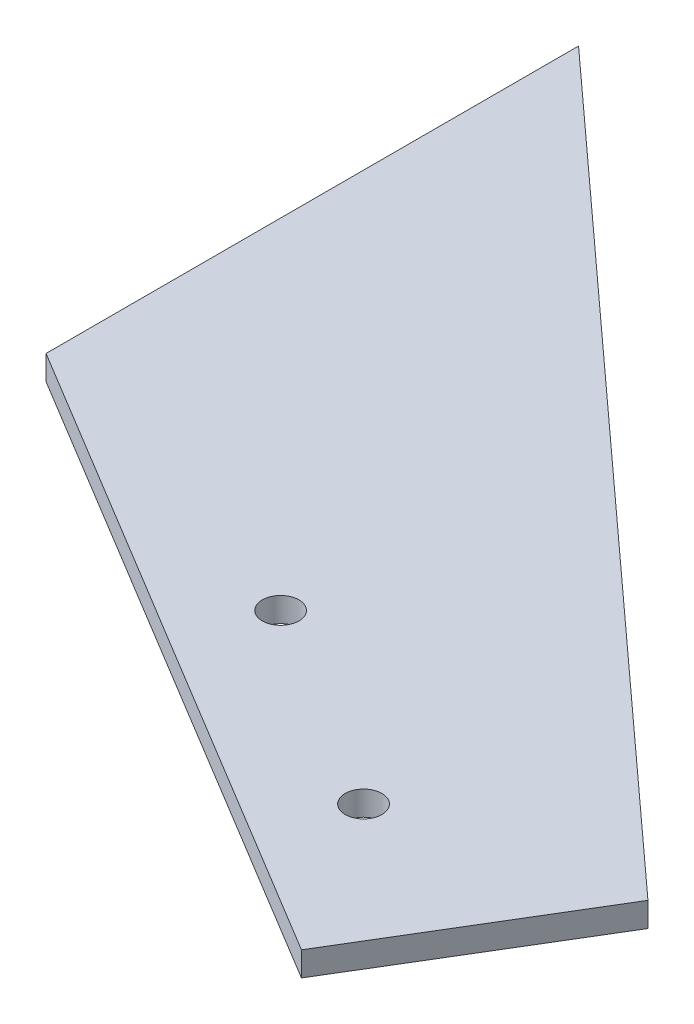
ISO-10303-21;
HEADER;
FILE_DESCRIPTION(('STEP AP214'),'2;1');
FILE_NAME('part.step','',(''),(''),'','','');
FILE_SCHEMA(('AUTOMOTIVE_DESIGN { 1 0 10303 214 1 1 1 1 }'));
ENDSEC;
DATA;
#1=APPLICATION_CONTEXT('core data for automotive mechanical design processes');
#2=APPLICATION_PROTOCOL_DEFINITION('international standard','automotive_design',2000,#1);
#3=PRODUCT_CONTEXT('',#1,'mechanical');
#4=PRODUCT('Part','Part','',(#3));
#5=PRODUCT_RELATED_PRODUCT_CATEGORY('part','',(#4));
#6=PRODUCT_DEFINITION_FORMATION('','',#4);
#7=PRODUCT_DEFINITION_CONTEXT('part definition',#1,'design');
#8=PRODUCT_DEFINITION('design','',#6,#7);
#9=PRODUCT_DEFINITION_SHAPE('','',#8);
#10=(LENGTH_UNIT() NAMED_UNIT(*) SI_UNIT(.MILLI.,.METRE.));
#11=(NAMED_UNIT(*) PLANE_ANGLE_UNIT() SI_UNIT($,.RADIAN.));
#12=(NAMED_UNIT(*) SI_UNIT($,.STERADIAN.) SOLID_ANGLE_UNIT());
#13=UNCERTAINTY_MEASURE_WITH_UNIT(LENGTH_MEASURE(1.E-05),#10,'distance_accuracy_value','');
#14=(GEOMETRIC_REPRESENTATION_CONTEXT(3) GLOBAL_UNCERTAINTY_ASSIGNED_CONTEXT((#13)) GLOBAL_UNIT_ASSIGNED_CONTEXT((#10,
#11,#12)) REPRESENTATION_CONTEXT('',''));
#15=CARTESIAN_POINT('',(0.,0.,0.));
#16=DIRECTION('',(0.,0.,1.));
#17=DIRECTION('',(1.,0.,0.));
#18=AXIS2_PLACEMENT_3D('',#15,#16,#17);
#19=CARTESIAN_POINT('',(-1315.151526504,-1741.9,2637.956845571));
#20=DIRECTION('',(0.,1.,0.));
#21=DIRECTION('',(0.965925826288944,0.,-0.258819045102985));
#22=AXIS2_PLACEMENT_3D('',#19,#20,#21);
#23=CYLINDRICAL_SURFACE('',#22,4.5);
#24=CARTESIAN_POINT('',(-1315.151526504,-1746.,2637.956845571));
#25=DIRECTION('',(0.,1.,0.));
#26=DIRECTION('',(0.965925826288944,0.,-0.258819045102985));
#27=AXIS2_PLACEMENT_3D('',#24,#25,#26);
#28=CIRCLE('',#27,4.5);
#29=CARTESIAN_POINT('',(-1310.804860285,-1746.,2636.792159868));
#30=VERTEX_POINT('',#29);
#31=EDGE_CURVE('E125',#30,#30,#28,.T.);
#32=ORIENTED_EDGE('',*,*,#31,.T.);
#33=DIRECTION('',(0.,-1.,0.));
#34=VECTOR('',#33,1.);
#35=CARTESIAN_POINT('',(-1310.804860285,-1741.9,2636.792159868));
#36=LINE('',#35,#34);
#37=CARTESIAN_POINT('',(-1310.804860285,-1752.,2636.792159868));
#38=VERTEX_POINT('',#37);
#39=EDGE_CURVE('E11',#30,#38,#36,.T.);
#40=ORIENTED_EDGE('',*,*,#39,.T.);
#41=CARTESIAN_POINT('',(-1315.151526504,-1752.,2637.956845571));
#42=DIRECTION('',(0.,1.,0.));
#43=DIRECTION('',(0.965925826288944,0.,-0.258819045102985));
#44=AXIS2_PLACEMENT_3D('',#41,#42,#43);
#45=CIRCLE('',#44,4.5);
#46=EDGE_CURVE('E141',#38,#38,#45,.T.);
#47=ORIENTED_EDGE('',*,*,#46,.F.);
#48=ORIENTED_EDGE('',*,*,#39,.F.);
#49=EDGE_LOOP('',(#32,#40,#47,#48));
#50=FACE_BOUND('',#49,.T.);
#51=ADVANCED_FACE('F17',(#50),#23,.F.);
#52=CARTESIAN_POINT('',(-1366.522079355,-1741.9,2606.955776238));
#53=DIRECTION('',(0.,1.,0.));
#54=DIRECTION('',(0.965925826288944,0.,-0.258819045102985));
#55=AXIS2_PLACEMENT_3D('',#52,#53,#54);
#56=CYLINDRICAL_SURFACE('',#55,4.5);
#57=CARTESIAN_POINT('',(-1366.522079355,-1746.,2606.955776238));
#58=DIRECTION('',(0.,1.,0.));
#59=DIRECTION('',(0.965925826288944,0.,-0.258819045102985));
#60=AXIS2_PLACEMENT_3D('',#57,#58,#59);
#61=CIRCLE('',#60,4.5);
#62=CARTESIAN_POINT('',(-1362.175413136,-1746.,2605.791090535));
#63=VERTEX_POINT('',#62);
#64=EDGE_CURVE('E126',#63,#63,#61,.T.);
#65=ORIENTED_EDGE('',*,*,#64,.T.);
#66=DIRECTION('',(0.,-1.,0.));
#67=VECTOR('',#66,1.);
#68=CARTESIAN_POINT('',(-1362.175413136,-1741.9,2605.791090535));
#69=LINE('',#68,#67);
#70=CARTESIAN_POINT('',(-1362.175413136,-1752.,2605.791090535));
#71=VERTEX_POINT('',#70);
#72=EDGE_CURVE('E27',#63,#71,#69,.T.);
#73=ORIENTED_EDGE('',*,*,#72,.T.);
#74=CARTESIAN_POINT('',(-1366.522079355,-1752.,2606.955776238));
#75=DIRECTION('',(0.,1.,0.));
#76=DIRECTION('',(0.965925826288944,0.,-0.258819045102985));
#77=AXIS2_PLACEMENT_3D('',#74,#75,#76);
#78=CIRCLE('',#77,4.5);
#79=EDGE_CURVE('E145',#71,#71,#78,.T.);
#80=ORIENTED_EDGE('',*,*,#79,.F.);
#81=ORIENTED_EDGE('',*,*,#72,.F.);
#82=EDGE_LOOP('',(#65,#73,#80,#81));
#83=FACE_BOUND('',#82,.T.);
#84=ADVANCED_FACE('F164',(#83),#56,.F.);
#85=CARTESIAN_POINT('',(-1259.720427225,-1746.,2623.521014012));
#86=DIRECTION('',(0.673199415853798,0.,-0.739460983753778));
#87=DIRECTION('',(0.,-1.,0.));
#88=AXIS2_PLACEMENT_3D('',#85,#86,#87);
#89=PLANE('',#88);
#90=DIRECTION('',(0.,-1.,0.));
#91=VECTOR('',#90,1.);
#92=CARTESIAN_POINT('',(-1259.720427225,-1746.,2623.521014012));
#93=LINE('',#92,#91);
#94=CARTESIAN_POINT('',(-1259.720427225,-1746.,2623.521014012));
#95=VERTEX_POINT('',#94);
#96=CARTESIAN_POINT('',(-1259.720427225,-1752.,2623.521014012));
#97=VERTEX_POINT('',#96);
#98=EDGE_CURVE('E137',#95,#97,#93,.T.);
#99=ORIENTED_EDGE('',*,*,#98,.T.);
#100=DIRECTION('',(-0.739460983753778,0.,-0.673199415853798));
#101=VECTOR('',#100,1.);
#102=CARTESIAN_POINT('',(-1259.720427225,-1752.,2623.521014012));
#103=LINE('',#102,#101);
#104=CARTESIAN_POINT('',(-1450.,-1752.,2450.291999831));
#105=VERTEX_POINT('',#104);
#106=EDGE_CURVE('E99',#97,#105,#103,.T.);
#107=ORIENTED_EDGE('',*,*,#106,.T.);
#108=DIRECTION('',(0.,-1.,0.));
#109=VECTOR('',#108,1.);
#110=CARTESIAN_POINT('',(-1450.,-1746.,2450.291999831));
#111=LINE('',#110,#109);
#112=CARTESIAN_POINT('',(-1450.,-1746.,2450.291999831));
#113=VERTEX_POINT('',#112);
#114=EDGE_CURVE('E110',#113,#105,#111,.T.);
#115=ORIENTED_EDGE('',*,*,#114,.F.);
#116=DIRECTION('',(-0.739460983753778,0.,-0.673199415853798));
#117=VECTOR('',#116,1.);
#118=CARTESIAN_POINT('',(-1259.720427225,-1746.,2623.521014012));
#119=LINE('',#118,#117);
#120=EDGE_CURVE('E93',#95,#113,#119,.T.);
#121=ORIENTED_EDGE('',*,*,#120,.F.);
#122=EDGE_LOOP('',(#99,#107,#115,#121));
#123=FACE_BOUND('',#122,.T.);
#124=ADVANCED_FACE('F178',(#123),#89,.T.);
#125=CARTESIAN_POINT('',(-1371.397319317,-1746.,2570.351072185));
#126=DIRECTION('',(0.,1.,0.));
#127=DIRECTION('',(1.,0.,0.));
#128=AXIS2_PLACEMENT_3D('',#125,#126,#127);
#129=PLANE('',#128);
#130=ORIENTED_EDGE('',*,*,#31,.F.);
#131=EDGE_LOOP('',(#130));
#132=FACE_BOUND('',#131,.T.);
#133=ORIENTED_EDGE('',*,*,#64,.F.);
#134=EDGE_LOOP('',(#133));
#135=FACE_BOUND('',#134,.T.);
#136=DIRECTION('',(0.856175880847204,0.,0.516684488886123));
#137=VECTOR('',#136,1.);
#138=CARTESIAN_POINT('',(-1450.,-1746.,2581.106243149));
#139=LINE('',#138,#137);
#140=CARTESIAN_POINT('',(-1450.,-1746.,2581.106243149));
#141=VERTEX_POINT('',#140);
#142=CARTESIAN_POINT('',(-1291.754865536,-1746.,2676.603918625));
#143=VERTEX_POINT('',#142);
#144=EDGE_CURVE('E91',#141,#143,#139,.T.);
#145=ORIENTED_EDGE('',*,*,#144,.T.);
#146=DIRECTION('',(0.516684488886123,0.,-0.856175880847204));
#147=VECTOR('',#146,1.);
#148=CARTESIAN_POINT('',(-1291.754865536,-1746.,2676.603918625));
#149=LINE('',#148,#147);
#150=EDGE_CURVE('E140',#143,#95,#149,.T.);
#151=ORIENTED_EDGE('',*,*,#150,.T.);
#152=ORIENTED_EDGE('',*,*,#120,.T.);
#153=DIRECTION('',(0.,0.,1.));
#154=VECTOR('',#153,1.);
#155=CARTESIAN_POINT('',(-1450.,-1746.,2450.291999831));
#156=LINE('',#155,#154);
#157=EDGE_CURVE('E88',#113,#141,#156,.T.);
#158=ORIENTED_EDGE('',*,*,#157,.T.);
#159=EDGE_LOOP('',(#145,#151,#152,#158));
#160=FACE_BOUND('',#159,.T.);
#161=ADVANCED_FACE('F19',(#132,#135,#160),#129,.T.);
#162=CARTESIAN_POINT('',(-1291.754865536,-1746.,2676.603918625));
#163=DIRECTION('',(0.856175880847204,0.,0.516684488886123));
#164=DIRECTION('',(0.,-1.,0.));
#165=AXIS2_PLACEMENT_3D('',#162,#163,#164);
#166=PLANE('',#165);
#167=DIRECTION('',(0.,-1.,0.));
#168=VECTOR('',#167,1.);
#169=CARTESIAN_POINT('',(-1291.754865536,-1746.,2676.603918625));
#170=LINE('',#169,#168);
#171=CARTESIAN_POINT('',(-1291.754865536,-1752.,2676.603918625));
#172=VERTEX_POINT('',#171);
#173=EDGE_CURVE('E108',#143,#172,#170,.T.);
#174=ORIENTED_EDGE('',*,*,#173,.T.);
#175=DIRECTION('',(0.516684488886123,0.,-0.856175880847204));
#176=VECTOR('',#175,1.);
#177=CARTESIAN_POINT('',(-1291.754865536,-1752.,2676.603918625));
#178=LINE('',#177,#176);
#179=EDGE_CURVE('E136',#172,#97,#178,.T.);
#180=ORIENTED_EDGE('',*,*,#179,.T.);
#181=ORIENTED_EDGE('',*,*,#98,.F.);
#182=ORIENTED_EDGE('',*,*,#150,.F.);
#183=EDGE_LOOP('',(#174,#180,#181,#182));
#184=FACE_BOUND('',#183,.T.);
#185=ADVANCED_FACE('F192',(#184),#166,.T.);
#186=CARTESIAN_POINT('',(-1371.397319317,-1752.,2570.351072185));
#187=DIRECTION('',(0.,1.,0.));
#188=DIRECTION('',(1.,0.,0.));
#189=AXIS2_PLACEMENT_3D('',#186,#187,#188);
#190=PLANE('',#189);
#191=ORIENTED_EDGE('',*,*,#46,.T.);
#192=EDGE_LOOP('',(#191));
#193=FACE_BOUND('',#192,.T.);
#194=ORIENTED_EDGE('',*,*,#79,.T.);
#195=EDGE_LOOP('',(#194));
#196=FACE_BOUND('',#195,.T.);
#197=DIRECTION('',(0.,0.,1.));
#198=VECTOR('',#197,1.);
#199=CARTESIAN_POINT('',(-1450.,-1752.,2450.291999831));
#200=LINE('',#199,#198);
#201=CARTESIAN_POINT('',(-1450.,-1752.,2581.106243149));
#202=VERTEX_POINT('',#201);
#203=EDGE_CURVE('E100',#105,#202,#200,.T.);
#204=ORIENTED_EDGE('',*,*,#203,.F.);
#205=ORIENTED_EDGE('',*,*,#106,.F.);
#206=ORIENTED_EDGE('',*,*,#179,.F.);
#207=DIRECTION('',(0.856175880847204,0.,0.516684488886123));
#208=VECTOR('',#207,1.);
#209=CARTESIAN_POINT('',(-1450.,-1752.,2581.106243149));
#210=LINE('',#209,#208);
#211=EDGE_CURVE('E116',#202,#172,#210,.T.);
#212=ORIENTED_EDGE('',*,*,#211,.F.);
#213=EDGE_LOOP('',(#204,#205,#206,#212));
#214=FACE_BOUND('',#213,.T.);
#215=ADVANCED_FACE('F185',(#193,#196,#214),#190,.F.);
#216=CARTESIAN_POINT('',(-1450.,-1746.,2450.291999831));
#217=DIRECTION('',(-1.,0.,0.));
#218=DIRECTION('',(0.,0.,1.));
#219=AXIS2_PLACEMENT_3D('',#216,#217,#218);
#220=PLANE('',#219);
#221=ORIENTED_EDGE('',*,*,#114,.T.);
#222=ORIENTED_EDGE('',*,*,#203,.T.);
#223=DIRECTION('',(0.,-1.,0.));
#224=VECTOR('',#223,1.);
#225=CARTESIAN_POINT('',(-1450.,-1746.,2581.106243149));
#226=LINE('',#225,#224);
#227=EDGE_CURVE('E106',#141,#202,#226,.T.);
#228=ORIENTED_EDGE('',*,*,#227,.F.);
#229=ORIENTED_EDGE('',*,*,#157,.F.);
#230=EDGE_LOOP('',(#221,#222,#228,#229));
#231=FACE_BOUND('',#230,.T.);
#232=ADVANCED_FACE('F112',(#231),#220,.T.);
#233=CARTESIAN_POINT('',(-1450.,-1746.,2581.106243149));
#234=DIRECTION('',(-0.516684488886123,0.,0.856175880847204));
#235=DIRECTION('',(0.,1.,0.));
#236=AXIS2_PLACEMENT_3D('',#233,#234,#235);
#237=PLANE('',#236);
#238=ORIENTED_EDGE('',*,*,#227,.T.);
#239=ORIENTED_EDGE('',*,*,#211,.T.);
#240=ORIENTED_EDGE('',*,*,#173,.F.);
#241=ORIENTED_EDGE('',*,*,#144,.F.);
#242=EDGE_LOOP('',(#238,#239,#240,#241));
#243=FACE_BOUND('',#242,.T.);
#244=ADVANCED_FACE('F104',(#243),#237,.T.);
#245=CLOSED_SHELL('',(#51,#84,#124,#161,#185,#215,#232,#244));
#246=MANIFOLD_SOLID_BREP('B1',#245);
#247=ADVANCED_BREP_SHAPE_REPRESENTATION('',(#18,#246),#14);
#248=SHAPE_DEFINITION_REPRESENTATION(#9,#247);
ENDSEC;
END-ISO-10303-21;
